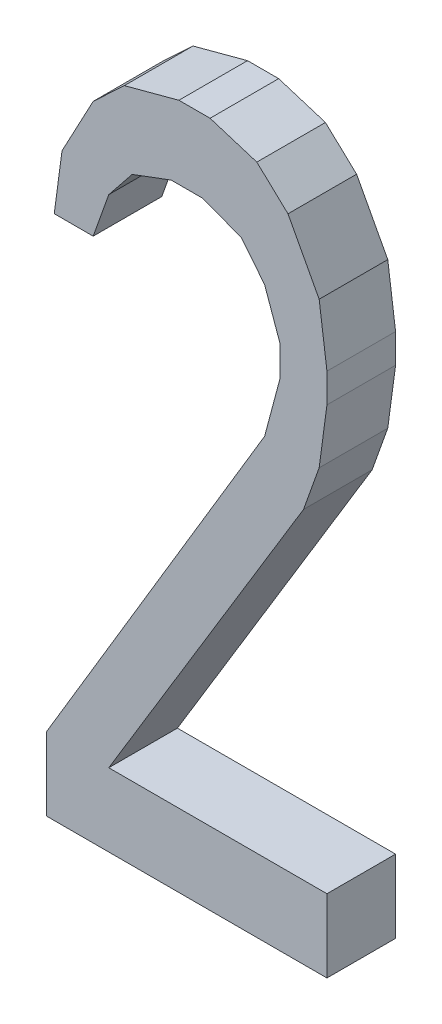
ISO-10303-21;
HEADER;
FILE_DESCRIPTION(('STEP AP214'),'2;1');
FILE_NAME('part.step','',(''),(''),'','','');
FILE_SCHEMA(('AUTOMOTIVE_DESIGN { 1 0 10303 214 1 1 1 1 }'));
ENDSEC;
DATA;
#1=APPLICATION_CONTEXT('core data for automotive mechanical design processes');
#2=APPLICATION_PROTOCOL_DEFINITION('international standard','automotive_design',2000,#1);
#3=PRODUCT_CONTEXT('',#1,'mechanical');
#4=PRODUCT('Part','Part','',(#3));
#5=PRODUCT_RELATED_PRODUCT_CATEGORY('part','',(#4));
#6=PRODUCT_DEFINITION_FORMATION('','',#4);
#7=PRODUCT_DEFINITION_CONTEXT('part definition',#1,'design');
#8=PRODUCT_DEFINITION('design','',#6,#7);
#9=PRODUCT_DEFINITION_SHAPE('','',#8);
#10=(LENGTH_UNIT() NAMED_UNIT(*) SI_UNIT(.MILLI.,.METRE.));
#11=(NAMED_UNIT(*) PLANE_ANGLE_UNIT() SI_UNIT($,.RADIAN.));
#12=(NAMED_UNIT(*) SI_UNIT($,.STERADIAN.) SOLID_ANGLE_UNIT());
#13=UNCERTAINTY_MEASURE_WITH_UNIT(LENGTH_MEASURE(1.E-05),#10,'distance_accuracy_value','');
#14=(GEOMETRIC_REPRESENTATION_CONTEXT(3) GLOBAL_UNCERTAINTY_ASSIGNED_CONTEXT((#13)) GLOBAL_UNIT_ASSIGNED_CONTEXT((#10,
#11,#12)) REPRESENTATION_CONTEXT('',''));
#15=CARTESIAN_POINT('',(0.,0.,0.));
#16=DIRECTION('',(0.,0.,1.));
#17=DIRECTION('',(1.,0.,0.));
#18=AXIS2_PLACEMENT_3D('',#15,#16,#17);
#19=CARTESIAN_POINT('',(-1.04461879526,-0.712240098159247,-20.));
#20=DIRECTION('',(0.,0.,1.));
#21=DIRECTION('',(1.,0.,0.));
#22=AXIS2_PLACEMENT_3D('',#19,#20,#21);
#23=PLANE('',#22);
#24=DIRECTION('',(0.,-1.,0.));
#25=VECTOR('',#24,1.);
#26=CARTESIAN_POINT('',(-25.,-5.987234038115,-20.));
#27=LINE('',#26,#25);
#28=CARTESIAN_POINT('',(-25.,-5.987234038115,-20.));
#29=VERTEX_POINT('',#28);
#30=CARTESIAN_POINT('',(-25.,-6.2,-20.));
#31=VERTEX_POINT('',#30);
#32=EDGE_CURVE('E11',#29,#31,#27,.T.);
#33=ORIENTED_EDGE('',*,*,#32,.F.);
#34=DIRECTION('',(-0.513102593228087,-0.858327285376978,0.));
#35=VECTOR('',#34,1.);
#36=CARTESIAN_POINT('',(-24.36404934028,-4.923404288292,-20.));
#37=LINE('',#36,#35);
#38=CARTESIAN_POINT('',(-24.36404934028,-4.923404288292,-20.));
#39=VERTEX_POINT('',#38);
#40=EDGE_CURVE('E24',#39,#29,#37,.T.);
#41=ORIENTED_EDGE('',*,*,#40,.F.);
#42=DIRECTION('',(-0.257848153420996,-0.966185453097583,0.));
#43=VECTOR('',#42,1.);
#44=CARTESIAN_POINT('',(-24.31862426995,-4.753191542625,-20.));
#45=LINE('',#44,#43);
#46=CARTESIAN_POINT('',(-24.31862426995,-4.753191542625,-20.));
#47=VERTEX_POINT('',#46);
#48=EDGE_CURVE('E220',#47,#39,#45,.T.);
#49=ORIENTED_EDGE('',*,*,#48,.F.);
#50=DIRECTION('',(0.,-1.,0.));
#51=VECTOR('',#50,1.);
#52=CARTESIAN_POINT('',(-24.31862426995,-4.668085050583,-20.));
#53=LINE('',#52,#51);
#54=CARTESIAN_POINT('',(-24.31862426995,-4.668085050583,-20.));
#55=VERTEX_POINT('',#54);
#56=EDGE_CURVE('E355',#55,#47,#53,.T.);
#57=ORIENTED_EDGE('',*,*,#56,.F.);
#58=DIRECTION('',(0.335239001268598,-0.942133117997894,0.));
#59=VECTOR('',#58,1.);
#60=CARTESIAN_POINT('',(-24.36404934028,-4.540425491333,-20.));
#61=LINE('',#60,#59);
#62=CARTESIAN_POINT('',(-24.36404934028,-4.540425491333,-20.));
#63=VERTEX_POINT('',#62);
#64=EDGE_CURVE('E352',#63,#55,#61,.T.);
#65=ORIENTED_EDGE('',*,*,#64,.F.);
#66=DIRECTION('',(0.62498849240601,-0.780633963109512,0.));
#67=VECTOR('',#66,1.);
#68=CARTESIAN_POINT('',(-24.43218691329,-4.4553191185,-20.));
#69=LINE('',#68,#67);
#70=CARTESIAN_POINT('',(-24.43218691329,-4.4553191185,-20.));
#71=VERTEX_POINT('',#70);
#72=EDGE_CURVE('E349',#71,#63,#69,.T.);
#73=ORIENTED_EDGE('',*,*,#72,.F.);
#74=DIRECTION('',(0.93641804705458,-0.350886365010792,0.));
#75=VECTOR('',#74,1.);
#76=CARTESIAN_POINT('',(-24.54574952413,-4.412765932083,-20.));
#77=LINE('',#76,#75);
#78=CARTESIAN_POINT('',(-24.54574952413,-4.412765932083,-20.));
#79=VERTEX_POINT('',#78);
#80=EDGE_CURVE('E346',#79,#71,#77,.T.);
#81=ORIENTED_EDGE('',*,*,#80,.F.);
#82=DIRECTION('',(1.,0.,0.));
#83=VECTOR('',#82,1.);
#84=CARTESIAN_POINT('',(-24.63659959981,-4.412765932083,-20.));
#85=LINE('',#84,#83);
#86=CARTESIAN_POINT('',(-24.63659959981,-4.412765932083,-20.));
#87=VERTEX_POINT('',#86);
#88=EDGE_CURVE('E343',#87,#79,#85,.T.);
#89=ORIENTED_EDGE('',*,*,#88,.F.);
#90=DIRECTION('',(0.936418063547381,0.350886320996093,0.));
#91=VECTOR('',#90,1.);
#92=CARTESIAN_POINT('',(-24.7501622269,-4.4553191185,-20.));
#93=LINE('',#92,#91);
#94=CARTESIAN_POINT('',(-24.7501622269,-4.4553191185,-20.));
#95=VERTEX_POINT('',#94);
#96=EDGE_CURVE('E340',#95,#87,#93,.T.);
#97=ORIENTED_EDGE('',*,*,#96,.F.);
#98=DIRECTION('',(0.62498849240601,0.780633963109512,0.));
#99=VECTOR('',#98,1.);
#100=CARTESIAN_POINT('',(-24.81829979991,-4.540425491333,-20.));
#101=LINE('',#100,#99);
#102=CARTESIAN_POINT('',(-24.81829979991,-4.540425491333,-20.));
#103=VERTEX_POINT('',#102);
#104=EDGE_CURVE('E337',#103,#95,#101,.T.);
#105=ORIENTED_EDGE('',*,*,#104,.F.);
#106=DIRECTION('',(0.335238894851816,0.942133155864145,0.));
#107=VECTOR('',#106,1.);
#108=CARTESIAN_POINT('',(-24.86372485399,-4.668085050583,-20.));
#109=LINE('',#108,#107);
#110=CARTESIAN_POINT('',(-24.86372485399,-4.668085050583,-20.));
#111=VERTEX_POINT('',#110);
#112=EDGE_CURVE('E334',#111,#103,#109,.T.);
#113=ORIENTED_EDGE('',*,*,#112,.F.);
#114=DIRECTION('',(1.,0.,0.));
#115=VECTOR('',#114,1.);
#116=CARTESIAN_POINT('',(-24.97728747499,-4.668085050583,-20.));
#117=LINE('',#116,#115);
#118=CARTESIAN_POINT('',(-24.97728747499,-4.668085050583,-20.));
#119=VERTEX_POINT('',#118);
#120=EDGE_CURVE('E331',#119,#111,#117,.T.);
#121=ORIENTED_EDGE('',*,*,#120,.F.);
#122=DIRECTION('',(-0.132263804293606,-0.991214550979647,0.));
#123=VECTOR('',#122,1.);
#124=CARTESIAN_POINT('',(-24.95457494998,-4.497872304916,-20.));
#125=LINE('',#124,#123);
#126=CARTESIAN_POINT('',(-24.95457494998,-4.497872304916,-20.));
#127=VERTEX_POINT('',#126);
#128=EDGE_CURVE('E328',#127,#119,#125,.T.);
#129=ORIENTED_EDGE('',*,*,#128,.F.);
#130=DIRECTION('',(-0.470870531051395,-0.88220232542619,0.));
#131=VECTOR('',#130,1.);
#132=CARTESIAN_POINT('',(-24.86372485399,-4.32765955925,-20.));
#133=LINE('',#132,#131);
#134=CARTESIAN_POINT('',(-24.86372485399,-4.32765955925,-20.));
#135=VERTEX_POINT('',#134);
#136=EDGE_CURVE('E325',#135,#127,#133,.T.);
#137=ORIENTED_EDGE('',*,*,#136,.F.);
#138=DIRECTION('',(-0.729800038606304,-0.683660664109204,0.));
#139=VECTOR('',#138,1.);
#140=CARTESIAN_POINT('',(-24.77287476207,-4.242553186417,-20.));
#141=LINE('',#140,#139);
#142=CARTESIAN_POINT('',(-24.77287476207,-4.242553186417,-20.));
#143=VERTEX_POINT('',#142);
#144=EDGE_CURVE('E322',#143,#135,#141,.T.);
#145=ORIENTED_EDGE('',*,*,#144,.F.);
#146=DIRECTION('',(-0.965997834211375,-0.258550158187793,0.));
#147=VECTOR('',#146,1.);
#148=CARTESIAN_POINT('',(-24.61388709714,-4.2,-20.));
#149=LINE('',#148,#147);
#150=CARTESIAN_POINT('',(-24.61388709714,-4.2,-20.));
#151=VERTEX_POINT('',#150);
#152=EDGE_CURVE('E319',#151,#143,#149,.T.);
#153=ORIENTED_EDGE('',*,*,#152,.F.);
#154=DIRECTION('',(-1.,0.,0.));
#155=VECTOR('',#154,1.);
#156=CARTESIAN_POINT('',(-24.52303698897,-4.2,-20.));
#157=LINE('',#156,#155);
#158=CARTESIAN_POINT('',(-24.52303698897,-4.2,-20.));
#159=VERTEX_POINT('',#158);
#160=EDGE_CURVE('E316',#159,#151,#157,.T.);
#161=ORIENTED_EDGE('',*,*,#160,.F.);
#162=DIRECTION('',(-0.954545357518661,0.298065698193488,0.));
#163=VECTOR('',#162,1.);
#164=CARTESIAN_POINT('',(-24.38676184296,-4.242553186417,-20.));
#165=LINE('',#164,#163);
#166=CARTESIAN_POINT('',(-24.38676184296,-4.242553186417,-20.));
#167=VERTEX_POINT('',#166);
#168=EDGE_CURVE('E313',#167,#159,#165,.T.);
#169=ORIENTED_EDGE('',*,*,#168,.F.);
#170=DIRECTION('',(-0.729799977612401,0.683660729219501,0.));
#171=VECTOR('',#170,1.);
#172=CARTESIAN_POINT('',(-24.29591176728,-4.32765955925,-20.));
#173=LINE('',#172,#171);
#174=CARTESIAN_POINT('',(-24.29591176728,-4.32765955925,-20.));
#175=VERTEX_POINT('',#174);
#176=EDGE_CURVE('E310',#175,#167,#173,.T.);
#177=ORIENTED_EDGE('',*,*,#176,.F.);
#178=DIRECTION('',(-0.470870711258515,0.882202229241629,0.));
#179=VECTOR('',#178,1.);
#180=CARTESIAN_POINT('',(-24.20506162662,-4.497872304916,-20.));
#181=LINE('',#180,#179);
#182=CARTESIAN_POINT('',(-24.20506162662,-4.497872304916,-20.));
#183=VERTEX_POINT('',#182);
#184=EDGE_CURVE('E307',#183,#175,#181,.T.);
#185=ORIENTED_EDGE('',*,*,#184,.F.);
#186=DIRECTION('',(-0.132263676490904,0.991214568033133,0.));
#187=VECTOR('',#186,1.);
#188=CARTESIAN_POINT('',(-24.18234912395,-4.668085050583,-20.));
#189=LINE('',#188,#187);
#190=CARTESIAN_POINT('',(-24.18234912395,-4.668085050583,-20.));
#191=VERTEX_POINT('',#190);
#192=EDGE_CURVE('E304',#191,#183,#189,.T.);
#193=ORIENTED_EDGE('',*,*,#192,.F.);
#194=DIRECTION('',(0.,1.,0.));
#195=VECTOR('',#194,1.);
#196=CARTESIAN_POINT('',(-24.18234912395,-4.753191542625,-20.));
#197=LINE('',#196,#195);
#198=CARTESIAN_POINT('',(-24.18234912395,-4.753191542625,-20.));
#199=VERTEX_POINT('',#198);
#200=EDGE_CURVE('E301',#199,#191,#197,.T.);
#201=ORIENTED_EDGE('',*,*,#200,.F.);
#202=DIRECTION('',(0.132263676490904,0.991214568033133,0.));
#203=VECTOR('',#202,1.);
#204=CARTESIAN_POINT('',(-24.20506162662,-4.923404288292,-20.));
#205=LINE('',#204,#203);
#206=CARTESIAN_POINT('',(-24.20506162662,-4.923404288292,-20.));
#207=VERTEX_POINT('',#206);
#208=EDGE_CURVE('E298',#207,#199,#205,.T.);
#209=ORIENTED_EDGE('',*,*,#208,.F.);
#210=DIRECTION('',(0.335239001268598,0.942133117997894,0.));
#211=VECTOR('',#210,1.);
#212=CARTESIAN_POINT('',(-24.25048669695,-5.051063847542,-20.));
#213=LINE('',#212,#211);
#214=CARTESIAN_POINT('',(-24.25048669695,-5.051063847542,-20.));
#215=VERTEX_POINT('',#214);
#216=EDGE_CURVE('E295',#215,#207,#213,.T.);
#217=ORIENTED_EDGE('',*,*,#216,.F.);
#218=DIRECTION('',(0.518593741025808,0.855020778559713,0.));
#219=VECTOR('',#218,1.);
#220=CARTESIAN_POINT('',(-24.81829979991,-5.987234038115,-20.));
#221=LINE('',#220,#219);
#222=CARTESIAN_POINT('',(-24.81829979991,-5.987234038115,-20.));
#223=VERTEX_POINT('',#222);
#224=EDGE_CURVE('E292',#223,#215,#221,.T.);
#225=ORIENTED_EDGE('',*,*,#224,.F.);
#226=DIRECTION('',(-1.,0.,0.));
#227=VECTOR('',#226,1.);
#228=CARTESIAN_POINT('',(-24.18234912395,-5.987234038115,-20.));
#229=LINE('',#228,#227);
#230=CARTESIAN_POINT('',(-24.18234912395,-5.987234038115,-20.));
#231=VERTEX_POINT('',#230);
#232=EDGE_CURVE('E289',#231,#223,#229,.T.);
#233=ORIENTED_EDGE('',*,*,#232,.F.);
#234=DIRECTION('',(0.,1.,0.));
#235=VECTOR('',#234,1.);
#236=CARTESIAN_POINT('',(-24.18234912395,-6.2,-20.));
#237=LINE('',#236,#235);
#238=CARTESIAN_POINT('',(-24.18234912395,-6.2,-20.));
#239=VERTEX_POINT('',#238);
#240=EDGE_CURVE('E286',#239,#231,#237,.T.);
#241=ORIENTED_EDGE('',*,*,#240,.F.);
#242=DIRECTION('',(1.,0.,0.));
#243=VECTOR('',#242,1.);
#244=CARTESIAN_POINT('',(-25.,-6.2,-20.));
#245=LINE('',#244,#243);
#246=EDGE_CURVE('E283',#31,#239,#245,.T.);
#247=ORIENTED_EDGE('',*,*,#246,.F.);
#248=EDGE_LOOP('',(#33,#41,#49,#57,#65,#73,#81,#89,#97,#105,#113,#121,#129,#137,#145,#153,#161,
#169,#177,#185,#193,#201,#209,#217,#225,#233,#241,#247));
#249=FACE_BOUND('',#248,.T.);
#250=ADVANCED_FACE('F17',(#249),#23,.F.);
#251=CARTESIAN_POINT('',(0.,0.,-19.8));
#252=DIRECTION('',(0.,0.,1.));
#253=DIRECTION('',(1.,0.,0.));
#254=AXIS2_PLACEMENT_3D('',#251,#252,#253);
#255=PLANE('',#254);
#256=DIRECTION('',(0.,-1.,0.));
#257=VECTOR('',#256,1.);
#258=CARTESIAN_POINT('',(-25.,-5.987234038115,-19.8));
#259=LINE('',#258,#257);
#260=CARTESIAN_POINT('',(-25.,-5.987234038115,-19.8));
#261=VERTEX_POINT('',#260);
#262=CARTESIAN_POINT('',(-25.,-6.2,-19.8));
#263=VERTEX_POINT('',#262);
#264=EDGE_CURVE('E281',#261,#263,#259,.T.);
#265=ORIENTED_EDGE('',*,*,#264,.T.);
#266=DIRECTION('',(1.,0.,0.));
#267=VECTOR('',#266,1.);
#268=CARTESIAN_POINT('',(-25.,-6.2,-19.8));
#269=LINE('',#268,#267);
#270=CARTESIAN_POINT('',(-24.18234912395,-6.2,-19.8));
#271=VERTEX_POINT('',#270);
#272=EDGE_CURVE('E279',#263,#271,#269,.T.);
#273=ORIENTED_EDGE('',*,*,#272,.T.);
#274=DIRECTION('',(0.,1.,0.));
#275=VECTOR('',#274,1.);
#276=CARTESIAN_POINT('',(-24.18234912395,-6.2,-19.8));
#277=LINE('',#276,#275);
#278=CARTESIAN_POINT('',(-24.18234912395,-5.987234038115,-19.8));
#279=VERTEX_POINT('',#278);
#280=EDGE_CURVE('E277',#271,#279,#277,.T.);
#281=ORIENTED_EDGE('',*,*,#280,.T.);
#282=DIRECTION('',(-1.,0.,0.));
#283=VECTOR('',#282,1.);
#284=CARTESIAN_POINT('',(-24.18234912395,-5.987234038115,-19.8));
#285=LINE('',#284,#283);
#286=CARTESIAN_POINT('',(-24.81829979991,-5.987234038115,-19.8));
#287=VERTEX_POINT('',#286);
#288=EDGE_CURVE('E275',#279,#287,#285,.T.);
#289=ORIENTED_EDGE('',*,*,#288,.T.);
#290=DIRECTION('',(0.518593741025808,0.855020778559713,0.));
#291=VECTOR('',#290,1.);
#292=CARTESIAN_POINT('',(-24.81829979991,-5.987234038115,-19.8));
#293=LINE('',#292,#291);
#294=CARTESIAN_POINT('',(-24.25048669695,-5.051063847542,-19.8));
#295=VERTEX_POINT('',#294);
#296=EDGE_CURVE('E273',#287,#295,#293,.T.);
#297=ORIENTED_EDGE('',*,*,#296,.T.);
#298=DIRECTION('',(0.335239001268598,0.942133117997894,0.));
#299=VECTOR('',#298,1.);
#300=CARTESIAN_POINT('',(-24.25048669695,-5.051063847542,-19.8));
#301=LINE('',#300,#299);
#302=CARTESIAN_POINT('',(-24.20506162662,-4.923404288292,-19.8));
#303=VERTEX_POINT('',#302);
#304=EDGE_CURVE('E271',#295,#303,#301,.T.);
#305=ORIENTED_EDGE('',*,*,#304,.T.);
#306=DIRECTION('',(0.132263676490904,0.991214568033133,0.));
#307=VECTOR('',#306,1.);
#308=CARTESIAN_POINT('',(-24.20506162662,-4.923404288292,-19.8));
#309=LINE('',#308,#307);
#310=CARTESIAN_POINT('',(-24.18234912395,-4.753191542625,-19.8));
#311=VERTEX_POINT('',#310);
#312=EDGE_CURVE('E269',#303,#311,#309,.T.);
#313=ORIENTED_EDGE('',*,*,#312,.T.);
#314=DIRECTION('',(0.,1.,0.));
#315=VECTOR('',#314,1.);
#316=CARTESIAN_POINT('',(-24.18234912395,-4.753191542625,-19.8));
#317=LINE('',#316,#315);
#318=CARTESIAN_POINT('',(-24.18234912395,-4.668085050583,-19.8));
#319=VERTEX_POINT('',#318);
#320=EDGE_CURVE('E267',#311,#319,#317,.T.);
#321=ORIENTED_EDGE('',*,*,#320,.T.);
#322=DIRECTION('',(-0.132263676490904,0.991214568033133,0.));
#323=VECTOR('',#322,1.);
#324=CARTESIAN_POINT('',(-24.18234912395,-4.668085050583,-19.8));
#325=LINE('',#324,#323);
#326=CARTESIAN_POINT('',(-24.20506162662,-4.497872304916,-19.8));
#327=VERTEX_POINT('',#326);
#328=EDGE_CURVE('E265',#319,#327,#325,.T.);
#329=ORIENTED_EDGE('',*,*,#328,.T.);
#330=DIRECTION('',(-0.470870711258515,0.882202229241629,0.));
#331=VECTOR('',#330,1.);
#332=CARTESIAN_POINT('',(-24.20506162662,-4.497872304916,-19.8));
#333=LINE('',#332,#331);
#334=CARTESIAN_POINT('',(-24.29591176728,-4.32765955925,-19.8));
#335=VERTEX_POINT('',#334);
#336=EDGE_CURVE('E263',#327,#335,#333,.T.);
#337=ORIENTED_EDGE('',*,*,#336,.T.);
#338=DIRECTION('',(-0.729799977612401,0.683660729219501,0.));
#339=VECTOR('',#338,1.);
#340=CARTESIAN_POINT('',(-24.29591176728,-4.32765955925,-19.8));
#341=LINE('',#340,#339);
#342=CARTESIAN_POINT('',(-24.38676184296,-4.242553186417,-19.8));
#343=VERTEX_POINT('',#342);
#344=EDGE_CURVE('E261',#335,#343,#341,.T.);
#345=ORIENTED_EDGE('',*,*,#344,.T.);
#346=DIRECTION('',(-0.954545357518661,0.298065698193488,0.));
#347=VECTOR('',#346,1.);
#348=CARTESIAN_POINT('',(-24.38676184296,-4.242553186417,-19.8));
#349=LINE('',#348,#347);
#350=CARTESIAN_POINT('',(-24.52303698897,-4.2,-19.8));
#351=VERTEX_POINT('',#350);
#352=EDGE_CURVE('E258',#343,#351,#349,.T.);
#353=ORIENTED_EDGE('',*,*,#352,.T.);
#354=DIRECTION('',(-1.,0.,0.));
#355=VECTOR('',#354,1.);
#356=CARTESIAN_POINT('',(-24.52303698897,-4.2,-19.8));
#357=LINE('',#356,#355);
#358=CARTESIAN_POINT('',(-24.61388709714,-4.2,-19.8));
#359=VERTEX_POINT('',#358);
#360=EDGE_CURVE('E255',#351,#359,#357,.T.);
#361=ORIENTED_EDGE('',*,*,#360,.T.);
#362=DIRECTION('',(-0.965997834211375,-0.258550158187793,0.));
#363=VECTOR('',#362,1.);
#364=CARTESIAN_POINT('',(-24.61388709714,-4.2,-19.8));
#365=LINE('',#364,#363);
#366=CARTESIAN_POINT('',(-24.77287476207,-4.242553186417,-19.8));
#367=VERTEX_POINT('',#366);
#368=EDGE_CURVE('E252',#359,#367,#365,.T.);
#369=ORIENTED_EDGE('',*,*,#368,.T.);
#370=DIRECTION('',(-0.729800038606304,-0.683660664109204,0.));
#371=VECTOR('',#370,1.);
#372=CARTESIAN_POINT('',(-24.77287476207,-4.242553186417,-19.8));
#373=LINE('',#372,#371);
#374=CARTESIAN_POINT('',(-24.86372485399,-4.32765955925,-19.8));
#375=VERTEX_POINT('',#374);
#376=EDGE_CURVE('E250',#367,#375,#373,.T.);
#377=ORIENTED_EDGE('',*,*,#376,.T.);
#378=DIRECTION('',(-0.470870531051395,-0.88220232542619,0.));
#379=VECTOR('',#378,1.);
#380=CARTESIAN_POINT('',(-24.86372485399,-4.32765955925,-19.8));
#381=LINE('',#380,#379);
#382=CARTESIAN_POINT('',(-24.95457494998,-4.497872304916,-19.8));
#383=VERTEX_POINT('',#382);
#384=EDGE_CURVE('E248',#375,#383,#381,.T.);
#385=ORIENTED_EDGE('',*,*,#384,.T.);
#386=DIRECTION('',(-0.132263804293606,-0.991214550979647,0.));
#387=VECTOR('',#386,1.);
#388=CARTESIAN_POINT('',(-24.95457494998,-4.497872304916,-19.8));
#389=LINE('',#388,#387);
#390=CARTESIAN_POINT('',(-24.97728747499,-4.668085050583,-19.8));
#391=VERTEX_POINT('',#390);
#392=EDGE_CURVE('E246',#383,#391,#389,.T.);
#393=ORIENTED_EDGE('',*,*,#392,.T.);
#394=DIRECTION('',(1.,0.,0.));
#395=VECTOR('',#394,1.);
#396=CARTESIAN_POINT('',(-24.97728747499,-4.668085050583,-19.8));
#397=LINE('',#396,#395);
#398=CARTESIAN_POINT('',(-24.86372485399,-4.668085050583,-19.8));
#399=VERTEX_POINT('',#398);
#400=EDGE_CURVE('E244',#391,#399,#397,.T.);
#401=ORIENTED_EDGE('',*,*,#400,.T.);
#402=DIRECTION('',(0.335238894851816,0.942133155864145,0.));
#403=VECTOR('',#402,1.);
#404=CARTESIAN_POINT('',(-24.86372485399,-4.668085050583,-19.8));
#405=LINE('',#404,#403);
#406=CARTESIAN_POINT('',(-24.81829979991,-4.540425491333,-19.8));
#407=VERTEX_POINT('',#406);
#408=EDGE_CURVE('E242',#399,#407,#405,.T.);
#409=ORIENTED_EDGE('',*,*,#408,.T.);
#410=DIRECTION('',(0.62498849240601,0.780633963109512,0.));
#411=VECTOR('',#410,1.);
#412=CARTESIAN_POINT('',(-24.81829979991,-4.540425491333,-19.8));
#413=LINE('',#412,#411);
#414=CARTESIAN_POINT('',(-24.7501622269,-4.4553191185,-19.8));
#415=VERTEX_POINT('',#414);
#416=EDGE_CURVE('E240',#407,#415,#413,.T.);
#417=ORIENTED_EDGE('',*,*,#416,.T.);
#418=DIRECTION('',(0.936418063547381,0.350886320996093,0.));
#419=VECTOR('',#418,1.);
#420=CARTESIAN_POINT('',(-24.7501622269,-4.4553191185,-19.8));
#421=LINE('',#420,#419);
#422=CARTESIAN_POINT('',(-24.63659959981,-4.412765932083,-19.8));
#423=VERTEX_POINT('',#422);
#424=EDGE_CURVE('E238',#415,#423,#421,.T.);
#425=ORIENTED_EDGE('',*,*,#424,.T.);
#426=DIRECTION('',(1.,0.,0.));
#427=VECTOR('',#426,1.);
#428=CARTESIAN_POINT('',(-24.63659959981,-4.412765932083,-19.8));
#429=LINE('',#428,#427);
#430=CARTESIAN_POINT('',(-24.54574952413,-4.412765932083,-19.8));
#431=VERTEX_POINT('',#430);
#432=EDGE_CURVE('E236',#423,#431,#429,.T.);
#433=ORIENTED_EDGE('',*,*,#432,.T.);
#434=DIRECTION('',(0.93641804705458,-0.350886365010792,0.));
#435=VECTOR('',#434,1.);
#436=CARTESIAN_POINT('',(-24.54574952413,-4.412765932083,-19.8));
#437=LINE('',#436,#435);
#438=CARTESIAN_POINT('',(-24.43218691329,-4.4553191185,-19.8));
#439=VERTEX_POINT('',#438);
#440=EDGE_CURVE('E234',#431,#439,#437,.T.);
#441=ORIENTED_EDGE('',*,*,#440,.T.);
#442=DIRECTION('',(0.62498849240601,-0.780633963109512,0.));
#443=VECTOR('',#442,1.);
#444=CARTESIAN_POINT('',(-24.43218691329,-4.4553191185,-19.8));
#445=LINE('',#444,#443);
#446=CARTESIAN_POINT('',(-24.36404934028,-4.540425491333,-19.8));
#447=VERTEX_POINT('',#446);
#448=EDGE_CURVE('E232',#439,#447,#445,.T.);
#449=ORIENTED_EDGE('',*,*,#448,.T.);
#450=DIRECTION('',(0.335239001268598,-0.942133117997894,0.));
#451=VECTOR('',#450,1.);
#452=CARTESIAN_POINT('',(-24.36404934028,-4.540425491333,-19.8));
#453=LINE('',#452,#451);
#454=CARTESIAN_POINT('',(-24.31862426995,-4.668085050583,-19.8));
#455=VERTEX_POINT('',#454);
#456=EDGE_CURVE('E230',#447,#455,#453,.T.);
#457=ORIENTED_EDGE('',*,*,#456,.T.);
#458=DIRECTION('',(0.,-1.,0.));
#459=VECTOR('',#458,1.);
#460=CARTESIAN_POINT('',(-24.31862426995,-4.668085050583,-19.8));
#461=LINE('',#460,#459);
#462=CARTESIAN_POINT('',(-24.31862426995,-4.753191542625,-19.8));
#463=VERTEX_POINT('',#462);
#464=EDGE_CURVE('E204',#455,#463,#461,.T.);
#465=ORIENTED_EDGE('',*,*,#464,.T.);
#466=DIRECTION('',(-0.257848153420996,-0.966185453097583,0.));
#467=VECTOR('',#466,1.);
#468=CARTESIAN_POINT('',(-24.31862426995,-4.753191542625,-19.8));
#469=LINE('',#468,#467);
#470=CARTESIAN_POINT('',(-24.36404934028,-4.923404288292,-19.8));
#471=VERTEX_POINT('',#470);
#472=EDGE_CURVE('E197',#463,#471,#469,.T.);
#473=ORIENTED_EDGE('',*,*,#472,.T.);
#474=DIRECTION('',(-0.513102593228087,-0.858327285376978,0.));
#475=VECTOR('',#474,1.);
#476=CARTESIAN_POINT('',(-24.36404934028,-4.923404288292,-19.8));
#477=LINE('',#476,#475);
#478=EDGE_CURVE('E201',#471,#261,#477,.T.);
#479=ORIENTED_EDGE('',*,*,#478,.T.);
#480=EDGE_LOOP('',(#265,#273,#281,#289,#297,#305,#313,#321,#329,#337,#345,#353,#361,#369,#377,
#385,#393,#401,#409,#417,#425,#433,#441,#449,#457,#465,#473,#479));
#481=FACE_BOUND('',#480,.T.);
#482=ADVANCED_FACE('F200',(#481),#255,.T.);
#483=CARTESIAN_POINT('',(-25.,-5.987234038115,-20.));
#484=DIRECTION('',(-1.,0.,0.));
#485=DIRECTION('',(0.,-1.,0.));
#486=AXIS2_PLACEMENT_3D('',#483,#484,#485);
#487=PLANE('',#486);
#488=ORIENTED_EDGE('',*,*,#32,.T.);
#489=DIRECTION('',(0.,0.,1.));
#490=VECTOR('',#489,1.);
#491=CARTESIAN_POINT('',(-25.,-6.2,-20.));
#492=LINE('',#491,#490);
#493=EDGE_CURVE('E216',#31,#263,#492,.T.);
#494=ORIENTED_EDGE('',*,*,#493,.T.);
#495=ORIENTED_EDGE('',*,*,#264,.F.);
#496=DIRECTION('',(0.,0.,1.));
#497=VECTOR('',#496,1.);
#498=CARTESIAN_POINT('',(-25.,-5.987234038115,-20.));
#499=LINE('',#498,#497);
#500=EDGE_CURVE('E214',#29,#261,#499,.T.);
#501=ORIENTED_EDGE('',*,*,#500,.F.);
#502=EDGE_LOOP('',(#488,#494,#495,#501));
#503=FACE_BOUND('',#502,.T.);
#504=ADVANCED_FACE('F358',(#503),#487,.T.);
#505=CARTESIAN_POINT('',(-24.36404934028,-4.923404288292,-20.));
#506=DIRECTION('',(-0.858327285376978,0.513102593228087,0.));
#507=DIRECTION('',(-0.513102593228087,-0.858327285376978,0.));
#508=AXIS2_PLACEMENT_3D('',#505,#506,#507);
#509=PLANE('',#508);
#510=ORIENTED_EDGE('',*,*,#40,.T.);
#511=ORIENTED_EDGE('',*,*,#500,.T.);
#512=ORIENTED_EDGE('',*,*,#478,.F.);
#513=DIRECTION('',(0.,0.,1.));
#514=VECTOR('',#513,1.);
#515=CARTESIAN_POINT('',(-24.36404934028,-4.923404288292,-20.));
#516=LINE('',#515,#514);
#517=EDGE_CURVE('E213',#39,#471,#516,.T.);
#518=ORIENTED_EDGE('',*,*,#517,.F.);
#519=EDGE_LOOP('',(#510,#511,#512,#518));
#520=FACE_BOUND('',#519,.T.);
#521=ADVANCED_FACE('F212',(#520),#509,.T.);
#522=CARTESIAN_POINT('',(-24.31862426995,-4.753191542625,-20.));
#523=DIRECTION('',(-0.966185453097584,0.257848153420996,0.));
#524=DIRECTION('',(-0.257848153420996,-0.966185453097584,0.));
#525=AXIS2_PLACEMENT_3D('',#522,#523,#524);
#526=PLANE('',#525);
#527=ORIENTED_EDGE('',*,*,#48,.T.);
#528=ORIENTED_EDGE('',*,*,#517,.T.);
#529=ORIENTED_EDGE('',*,*,#472,.F.);
#530=DIRECTION('',(0.,0.,1.));
#531=VECTOR('',#530,1.);
#532=CARTESIAN_POINT('',(-24.31862426995,-4.753191542625,-20.));
#533=LINE('',#532,#531);
#534=EDGE_CURVE('E221',#47,#463,#533,.T.);
#535=ORIENTED_EDGE('',*,*,#534,.F.);
#536=EDGE_LOOP('',(#527,#528,#529,#535));
#537=FACE_BOUND('',#536,.T.);
#538=ADVANCED_FACE('F219',(#537),#526,.T.);
#539=CARTESIAN_POINT('',(-24.31862426995,-4.668085050583,-20.));
#540=DIRECTION('',(-1.,0.,0.));
#541=DIRECTION('',(0.,-1.,0.));
#542=AXIS2_PLACEMENT_3D('',#539,#540,#541);
#543=PLANE('',#542);
#544=ORIENTED_EDGE('',*,*,#56,.T.);
#545=ORIENTED_EDGE('',*,*,#534,.T.);
#546=ORIENTED_EDGE('',*,*,#464,.F.);
#547=DIRECTION('',(0.,0.,1.));
#548=VECTOR('',#547,1.);
#549=CARTESIAN_POINT('',(-24.31862426995,-4.668085050583,-20.));
#550=LINE('',#549,#548);
#551=EDGE_CURVE('E224',#55,#455,#550,.T.);
#552=ORIENTED_EDGE('',*,*,#551,.F.);
#553=EDGE_LOOP('',(#544,#545,#546,#552));
#554=FACE_BOUND('',#553,.T.);
#555=ADVANCED_FACE('F439',(#554),#543,.T.);
#556=CARTESIAN_POINT('',(-24.36404934028,-4.540425491333,-20.));
#557=DIRECTION('',(-0.942133117997894,-0.335239001268598,0.));
#558=DIRECTION('',(0.335239001268598,-0.942133117997894,0.));
#559=AXIS2_PLACEMENT_3D('',#556,#557,#558);
#560=PLANE('',#559);
#561=ORIENTED_EDGE('',*,*,#64,.T.);
#562=ORIENTED_EDGE('',*,*,#551,.T.);
#563=ORIENTED_EDGE('',*,*,#456,.F.);
#564=DIRECTION('',(0.,0.,1.));
#565=VECTOR('',#564,1.);
#566=CARTESIAN_POINT('',(-24.36404934028,-4.540425491333,-20.));
#567=LINE('',#566,#565);
#568=EDGE_CURVE('E430',#63,#447,#567,.T.);
#569=ORIENTED_EDGE('',*,*,#568,.F.);
#570=EDGE_LOOP('',(#561,#562,#563,#569));
#571=FACE_BOUND('',#570,.T.);
#572=ADVANCED_FACE('F436',(#571),#560,.T.);
#573=CARTESIAN_POINT('',(-24.43218691329,-4.4553191185,-20.));
#574=DIRECTION('',(-0.780633963109512,-0.62498849240601,0.));
#575=DIRECTION('',(0.62498849240601,-0.780633963109512,0.));
#576=AXIS2_PLACEMENT_3D('',#573,#574,#575);
#577=PLANE('',#576);
#578=ORIENTED_EDGE('',*,*,#72,.T.);
#579=ORIENTED_EDGE('',*,*,#568,.T.);
#580=ORIENTED_EDGE('',*,*,#448,.F.);
#581=DIRECTION('',(0.,0.,1.));
#582=VECTOR('',#581,1.);
#583=CARTESIAN_POINT('',(-24.43218691329,-4.4553191185,-20.));
#584=LINE('',#583,#582);
#585=EDGE_CURVE('E427',#71,#439,#584,.T.);
#586=ORIENTED_EDGE('',*,*,#585,.F.);
#587=EDGE_LOOP('',(#578,#579,#580,#586));
#588=FACE_BOUND('',#587,.T.);
#589=ADVANCED_FACE('F442',(#588),#577,.T.);
#590=CARTESIAN_POINT('',(-24.54574952413,-4.412765932083,-20.));
#591=DIRECTION('',(-0.350886365010792,-0.93641804705458,0.));
#592=DIRECTION('',(0.93641804705458,-0.350886365010792,0.));
#593=AXIS2_PLACEMENT_3D('',#590,#591,#592);
#594=PLANE('',#593);
#595=ORIENTED_EDGE('',*,*,#80,.T.);
#596=ORIENTED_EDGE('',*,*,#585,.T.);
#597=ORIENTED_EDGE('',*,*,#440,.F.);
#598=DIRECTION('',(0.,0.,1.));
#599=VECTOR('',#598,1.);
#600=CARTESIAN_POINT('',(-24.54574952413,-4.412765932083,-20.));
#601=LINE('',#600,#599);
#602=EDGE_CURVE('E424',#79,#431,#601,.T.);
#603=ORIENTED_EDGE('',*,*,#602,.F.);
#604=EDGE_LOOP('',(#595,#596,#597,#603));
#605=FACE_BOUND('',#604,.T.);
#606=ADVANCED_FACE('F446',(#605),#594,.T.);
#607=CARTESIAN_POINT('',(-24.63659959981,-4.412765932083,-20.));
#608=DIRECTION('',(0.,-1.,0.));
#609=DIRECTION('',(1.,0.,0.));
#610=AXIS2_PLACEMENT_3D('',#607,#608,#609);
#611=PLANE('',#610);
#612=ORIENTED_EDGE('',*,*,#88,.T.);
#613=ORIENTED_EDGE('',*,*,#602,.T.);
#614=ORIENTED_EDGE('',*,*,#432,.F.);
#615=DIRECTION('',(0.,0.,1.));
#616=VECTOR('',#615,1.);
#617=CARTESIAN_POINT('',(-24.63659959981,-4.412765932083,-20.));
#618=LINE('',#617,#616);
#619=EDGE_CURVE('E421',#87,#423,#618,.T.);
#620=ORIENTED_EDGE('',*,*,#619,.F.);
#621=EDGE_LOOP('',(#612,#613,#614,#620));
#622=FACE_BOUND('',#621,.T.);
#623=ADVANCED_FACE('F450',(#622),#611,.T.);
#624=CARTESIAN_POINT('',(-24.7501622269,-4.4553191185,-20.));
#625=DIRECTION('',(0.350886320996093,-0.936418063547381,0.));
#626=DIRECTION('',(0.936418063547381,0.350886320996093,0.));
#627=AXIS2_PLACEMENT_3D('',#624,#625,#626);
#628=PLANE('',#627);
#629=ORIENTED_EDGE('',*,*,#96,.T.);
#630=ORIENTED_EDGE('',*,*,#619,.T.);
#631=ORIENTED_EDGE('',*,*,#424,.F.);
#632=DIRECTION('',(0.,0.,1.));
#633=VECTOR('',#632,1.);
#634=CARTESIAN_POINT('',(-24.7501622269,-4.4553191185,-20.));
#635=LINE('',#634,#633);
#636=EDGE_CURVE('E418',#95,#415,#635,.T.);
#637=ORIENTED_EDGE('',*,*,#636,.F.);
#638=EDGE_LOOP('',(#629,#630,#631,#637));
#639=FACE_BOUND('',#638,.T.);
#640=ADVANCED_FACE('F454',(#639),#628,.T.);
#641=CARTESIAN_POINT('',(-24.81829979991,-4.540425491333,-20.));
#642=DIRECTION('',(0.780633963109512,-0.62498849240601,0.));
#643=DIRECTION('',(0.62498849240601,0.780633963109512,0.));
#644=AXIS2_PLACEMENT_3D('',#641,#642,#643);
#645=PLANE('',#644);
#646=ORIENTED_EDGE('',*,*,#104,.T.);
#647=ORIENTED_EDGE('',*,*,#636,.T.);
#648=ORIENTED_EDGE('',*,*,#416,.F.);
#649=DIRECTION('',(0.,0.,1.));
#650=VECTOR('',#649,1.);
#651=CARTESIAN_POINT('',(-24.81829979991,-4.540425491333,-20.));
#652=LINE('',#651,#650);
#653=EDGE_CURVE('E415',#103,#407,#652,.T.);
#654=ORIENTED_EDGE('',*,*,#653,.F.);
#655=EDGE_LOOP('',(#646,#647,#648,#654));
#656=FACE_BOUND('',#655,.T.);
#657=ADVANCED_FACE('F458',(#656),#645,.T.);
#658=CARTESIAN_POINT('',(-24.86372485399,-4.668085050583,-20.));
#659=DIRECTION('',(0.942133155864145,-0.335238894851816,0.));
#660=DIRECTION('',(0.335238894851816,0.942133155864145,0.));
#661=AXIS2_PLACEMENT_3D('',#658,#659,#660);
#662=PLANE('',#661);
#663=ORIENTED_EDGE('',*,*,#112,.T.);
#664=ORIENTED_EDGE('',*,*,#653,.T.);
#665=ORIENTED_EDGE('',*,*,#408,.F.);
#666=DIRECTION('',(0.,0.,1.));
#667=VECTOR('',#666,1.);
#668=CARTESIAN_POINT('',(-24.86372485399,-4.668085050583,-20.));
#669=LINE('',#668,#667);
#670=EDGE_CURVE('E412',#111,#399,#669,.T.);
#671=ORIENTED_EDGE('',*,*,#670,.F.);
#672=EDGE_LOOP('',(#663,#664,#665,#671));
#673=FACE_BOUND('',#672,.T.);
#674=ADVANCED_FACE('F462',(#673),#662,.T.);
#675=CARTESIAN_POINT('',(-24.97728747499,-4.668085050583,-20.));
#676=DIRECTION('',(0.,-1.,0.));
#677=DIRECTION('',(1.,0.,0.));
#678=AXIS2_PLACEMENT_3D('',#675,#676,#677);
#679=PLANE('',#678);
#680=ORIENTED_EDGE('',*,*,#120,.T.);
#681=ORIENTED_EDGE('',*,*,#670,.T.);
#682=ORIENTED_EDGE('',*,*,#400,.F.);
#683=DIRECTION('',(0.,0.,1.));
#684=VECTOR('',#683,1.);
#685=CARTESIAN_POINT('',(-24.97728747499,-4.668085050583,-20.));
#686=LINE('',#685,#684);
#687=EDGE_CURVE('E409',#119,#391,#686,.T.);
#688=ORIENTED_EDGE('',*,*,#687,.F.);
#689=EDGE_LOOP('',(#680,#681,#682,#688));
#690=FACE_BOUND('',#689,.T.);
#691=ADVANCED_FACE('F466',(#690),#679,.T.);
#692=CARTESIAN_POINT('',(-24.95457494998,-4.497872304916,-20.));
#693=DIRECTION('',(-0.991214550979634,0.132263804293704,0.));
#694=DIRECTION('',(-0.132263804293704,-0.991214550979634,0.));
#695=AXIS2_PLACEMENT_3D('',#692,#693,#694);
#696=PLANE('',#695);
#697=ORIENTED_EDGE('',*,*,#128,.T.);
#698=ORIENTED_EDGE('',*,*,#687,.T.);
#699=ORIENTED_EDGE('',*,*,#392,.F.);
#700=DIRECTION('',(0.,0.,1.));
#701=VECTOR('',#700,1.);
#702=CARTESIAN_POINT('',(-24.95457494998,-4.497872304916,-20.));
#703=LINE('',#702,#701);
#704=EDGE_CURVE('E406',#127,#383,#703,.T.);
#705=ORIENTED_EDGE('',*,*,#704,.F.);
#706=EDGE_LOOP('',(#697,#698,#699,#705));
#707=FACE_BOUND('',#706,.T.);
#708=ADVANCED_FACE('F470',(#707),#696,.T.);
#709=CARTESIAN_POINT('',(-24.86372485399,-4.32765955925,-20.));
#710=DIRECTION('',(-0.88220232542619,0.470870531051395,0.));
#711=DIRECTION('',(-0.470870531051395,-0.88220232542619,0.));
#712=AXIS2_PLACEMENT_3D('',#709,#710,#711);
#713=PLANE('',#712);
#714=ORIENTED_EDGE('',*,*,#136,.T.);
#715=ORIENTED_EDGE('',*,*,#704,.T.);
#716=ORIENTED_EDGE('',*,*,#384,.F.);
#717=DIRECTION('',(0.,0.,1.));
#718=VECTOR('',#717,1.);
#719=CARTESIAN_POINT('',(-24.86372485399,-4.32765955925,-20.));
#720=LINE('',#719,#718);
#721=EDGE_CURVE('E403',#135,#375,#720,.T.);
#722=ORIENTED_EDGE('',*,*,#721,.F.);
#723=EDGE_LOOP('',(#714,#715,#716,#722));
#724=FACE_BOUND('',#723,.T.);
#725=ADVANCED_FACE('F474',(#724),#713,.T.);
#726=CARTESIAN_POINT('',(-24.77287476207,-4.242553186417,-20.));
#727=DIRECTION('',(-0.683660664109204,0.729800038606304,0.));
#728=DIRECTION('',(-0.729800038606304,-0.683660664109204,0.));
#729=AXIS2_PLACEMENT_3D('',#726,#727,#728);
#730=PLANE('',#729);
#731=ORIENTED_EDGE('',*,*,#144,.T.);
#732=ORIENTED_EDGE('',*,*,#721,.T.);
#733=ORIENTED_EDGE('',*,*,#376,.F.);
#734=DIRECTION('',(0.,0.,1.));
#735=VECTOR('',#734,1.);
#736=CARTESIAN_POINT('',(-24.77287476207,-4.242553186417,-20.));
#737=LINE('',#736,#735);
#738=EDGE_CURVE('E400',#143,#367,#737,.T.);
#739=ORIENTED_EDGE('',*,*,#738,.F.);
#740=EDGE_LOOP('',(#731,#732,#733,#739));
#741=FACE_BOUND('',#740,.T.);
#742=ADVANCED_FACE('F477',(#741),#730,.T.);
#743=CARTESIAN_POINT('',(-24.61388709714,-4.2,-20.));
#744=DIRECTION('',(-0.2585501581877,0.9659978342114,0.));
#745=DIRECTION('',(-0.9659978342114,-0.2585501581877,0.));
#746=AXIS2_PLACEMENT_3D('',#743,#744,#745);
#747=PLANE('',#746);
#748=ORIENTED_EDGE('',*,*,#152,.T.);
#749=ORIENTED_EDGE('',*,*,#738,.T.);
#750=ORIENTED_EDGE('',*,*,#368,.F.);
#751=DIRECTION('',(0.,0.,1.));
#752=VECTOR('',#751,1.);
#753=CARTESIAN_POINT('',(-24.61388709714,-4.2,-20.));
#754=LINE('',#753,#752);
#755=EDGE_CURVE('E398',#151,#359,#754,.T.);
#756=ORIENTED_EDGE('',*,*,#755,.F.);
#757=EDGE_LOOP('',(#748,#749,#750,#756));
#758=FACE_BOUND('',#757,.T.);
#759=ADVANCED_FACE('F481',(#758),#747,.T.);
#760=CARTESIAN_POINT('',(-24.52303698897,-4.2,-20.));
#761=DIRECTION('',(0.,1.,0.));
#762=DIRECTION('',(-1.,0.,0.));
#763=AXIS2_PLACEMENT_3D('',#760,#761,#762);
#764=PLANE('',#763);
#765=ORIENTED_EDGE('',*,*,#160,.T.);
#766=ORIENTED_EDGE('',*,*,#755,.T.);
#767=ORIENTED_EDGE('',*,*,#360,.F.);
#768=DIRECTION('',(0.,0.,1.));
#769=VECTOR('',#768,1.);
#770=CARTESIAN_POINT('',(-24.52303698897,-4.2,-20.));
#771=LINE('',#770,#769);
#772=EDGE_CURVE('E396',#159,#351,#771,.T.);
#773=ORIENTED_EDGE('',*,*,#772,.F.);
#774=EDGE_LOOP('',(#765,#766,#767,#773));
#775=FACE_BOUND('',#774,.T.);
#776=ADVANCED_FACE('F485',(#775),#764,.T.);
#777=CARTESIAN_POINT('',(-24.38676184296,-4.242553186417,-20.));
#778=DIRECTION('',(0.298065698193488,0.954545357518661,0.));
#779=DIRECTION('',(-0.954545357518661,0.298065698193488,0.));
#780=AXIS2_PLACEMENT_3D('',#777,#778,#779);
#781=PLANE('',#780);
#782=ORIENTED_EDGE('',*,*,#168,.T.);
#783=ORIENTED_EDGE('',*,*,#772,.T.);
#784=ORIENTED_EDGE('',*,*,#352,.F.);
#785=DIRECTION('',(0.,0.,1.));
#786=VECTOR('',#785,1.);
#787=CARTESIAN_POINT('',(-24.38676184296,-4.242553186417,-20.));
#788=LINE('',#787,#786);
#789=EDGE_CURVE('E393',#167,#343,#788,.T.);
#790=ORIENTED_EDGE('',*,*,#789,.F.);
#791=EDGE_LOOP('',(#782,#783,#784,#790));
#792=FACE_BOUND('',#791,.T.);
#793=ADVANCED_FACE('F491',(#792),#781,.T.);
#794=CARTESIAN_POINT('',(-24.29591176728,-4.32765955925,-20.));
#795=DIRECTION('',(0.683660729219501,0.729799977612401,0.));
#796=DIRECTION('',(-0.729799977612401,0.683660729219501,0.));
#797=AXIS2_PLACEMENT_3D('',#794,#795,#796);
#798=PLANE('',#797);
#799=ORIENTED_EDGE('',*,*,#176,.T.);
#800=ORIENTED_EDGE('',*,*,#789,.T.);
#801=ORIENTED_EDGE('',*,*,#344,.F.);
#802=DIRECTION('',(0.,0.,1.));
#803=VECTOR('',#802,1.);
#804=CARTESIAN_POINT('',(-24.29591176728,-4.32765955925,-20.));
#805=LINE('',#804,#803);
#806=EDGE_CURVE('E390',#175,#335,#805,.T.);
#807=ORIENTED_EDGE('',*,*,#806,.F.);
#808=EDGE_LOOP('',(#799,#800,#801,#807));
#809=FACE_BOUND('',#808,.T.);
#810=ADVANCED_FACE('F493',(#809),#798,.T.);
#811=CARTESIAN_POINT('',(-24.20506162662,-4.497872304916,-20.));
#812=DIRECTION('',(0.882202229241629,0.470870711258516,0.));
#813=DIRECTION('',(-0.470870711258516,0.882202229241629,0.));
#814=AXIS2_PLACEMENT_3D('',#811,#812,#813);
#815=PLANE('',#814);
#816=ORIENTED_EDGE('',*,*,#184,.T.);
#817=ORIENTED_EDGE('',*,*,#806,.T.);
#818=ORIENTED_EDGE('',*,*,#336,.F.);
#819=DIRECTION('',(0.,0.,1.));
#820=VECTOR('',#819,1.);
#821=CARTESIAN_POINT('',(-24.20506162662,-4.497872304916,-20.));
#822=LINE('',#821,#820);
#823=EDGE_CURVE('E387',#183,#327,#822,.T.);
#824=ORIENTED_EDGE('',*,*,#823,.F.);
#825=EDGE_LOOP('',(#816,#817,#818,#824));
#826=FACE_BOUND('',#825,.T.);
#827=ADVANCED_FACE('F497',(#826),#815,.T.);
#828=CARTESIAN_POINT('',(-24.18234912395,-4.668085050583,-20.));
#829=DIRECTION('',(0.991214568033133,0.132263676490904,0.));
#830=DIRECTION('',(-0.132263676490904,0.991214568033133,0.));
#831=AXIS2_PLACEMENT_3D('',#828,#829,#830);
#832=PLANE('',#831);
#833=ORIENTED_EDGE('',*,*,#192,.T.);
#834=ORIENTED_EDGE('',*,*,#823,.T.);
#835=ORIENTED_EDGE('',*,*,#328,.F.);
#836=DIRECTION('',(0.,0.,1.));
#837=VECTOR('',#836,1.);
#838=CARTESIAN_POINT('',(-24.18234912395,-4.668085050583,-20.));
#839=LINE('',#838,#837);
#840=EDGE_CURVE('E384',#191,#319,#839,.T.);
#841=ORIENTED_EDGE('',*,*,#840,.F.);
#842=EDGE_LOOP('',(#833,#834,#835,#841));
#843=FACE_BOUND('',#842,.T.);
#844=ADVANCED_FACE('F501',(#843),#832,.T.);
#845=CARTESIAN_POINT('',(-24.18234912395,-4.753191542625,-20.));
#846=DIRECTION('',(1.,0.,0.));
#847=DIRECTION('',(0.,1.,0.));
#848=AXIS2_PLACEMENT_3D('',#845,#846,#847);
#849=PLANE('',#848);
#850=ORIENTED_EDGE('',*,*,#200,.T.);
#851=ORIENTED_EDGE('',*,*,#840,.T.);
#852=ORIENTED_EDGE('',*,*,#320,.F.);
#853=DIRECTION('',(0.,0.,1.));
#854=VECTOR('',#853,1.);
#855=CARTESIAN_POINT('',(-24.18234912395,-4.753191542625,-20.));
#856=LINE('',#855,#854);
#857=EDGE_CURVE('E381',#199,#311,#856,.T.);
#858=ORIENTED_EDGE('',*,*,#857,.F.);
#859=EDGE_LOOP('',(#850,#851,#852,#858));
#860=FACE_BOUND('',#859,.T.);
#861=ADVANCED_FACE('F505',(#860),#849,.T.);
#862=CARTESIAN_POINT('',(-24.20506162662,-4.923404288292,-20.));
#863=DIRECTION('',(0.991214568033133,-0.132263676490904,0.));
#864=DIRECTION('',(0.132263676490904,0.991214568033133,0.));
#865=AXIS2_PLACEMENT_3D('',#862,#863,#864);
#866=PLANE('',#865);
#867=ORIENTED_EDGE('',*,*,#208,.T.);
#868=ORIENTED_EDGE('',*,*,#857,.T.);
#869=ORIENTED_EDGE('',*,*,#312,.F.);
#870=DIRECTION('',(0.,0.,1.));
#871=VECTOR('',#870,1.);
#872=CARTESIAN_POINT('',(-24.20506162662,-4.923404288292,-20.));
#873=LINE('',#872,#871);
#874=EDGE_CURVE('E378',#207,#303,#873,.T.);
#875=ORIENTED_EDGE('',*,*,#874,.F.);
#876=EDGE_LOOP('',(#867,#868,#869,#875));
#877=FACE_BOUND('',#876,.T.);
#878=ADVANCED_FACE('F509',(#877),#866,.T.);
#879=CARTESIAN_POINT('',(-24.25048669695,-5.051063847542,-20.));
#880=DIRECTION('',(0.942133117997894,-0.335239001268598,0.));
#881=DIRECTION('',(0.335239001268598,0.942133117997894,0.));
#882=AXIS2_PLACEMENT_3D('',#879,#880,#881);
#883=PLANE('',#882);
#884=ORIENTED_EDGE('',*,*,#216,.T.);
#885=ORIENTED_EDGE('',*,*,#874,.T.);
#886=ORIENTED_EDGE('',*,*,#304,.F.);
#887=DIRECTION('',(0.,0.,1.));
#888=VECTOR('',#887,1.);
#889=CARTESIAN_POINT('',(-24.25048669695,-5.051063847542,-20.));
#890=LINE('',#889,#888);
#891=EDGE_CURVE('E375',#215,#295,#890,.T.);
#892=ORIENTED_EDGE('',*,*,#891,.F.);
#893=EDGE_LOOP('',(#884,#885,#886,#892));
#894=FACE_BOUND('',#893,.T.);
#895=ADVANCED_FACE('F513',(#894),#883,.T.);
#896=CARTESIAN_POINT('',(-24.81829979991,-5.987234038115,-20.));
#897=DIRECTION('',(0.855020778559713,-0.518593741025808,0.));
#898=DIRECTION('',(0.518593741025808,0.855020778559713,0.));
#899=AXIS2_PLACEMENT_3D('',#896,#897,#898);
#900=PLANE('',#899);
#901=ORIENTED_EDGE('',*,*,#224,.T.);
#902=ORIENTED_EDGE('',*,*,#891,.T.);
#903=ORIENTED_EDGE('',*,*,#296,.F.);
#904=DIRECTION('',(0.,0.,1.));
#905=VECTOR('',#904,1.);
#906=CARTESIAN_POINT('',(-24.81829979991,-5.987234038115,-20.));
#907=LINE('',#906,#905);
#908=EDGE_CURVE('E370',#223,#287,#907,.T.);
#909=ORIENTED_EDGE('',*,*,#908,.F.);
#910=EDGE_LOOP('',(#901,#902,#903,#909));
#911=FACE_BOUND('',#910,.T.);
#912=ADVANCED_FACE('F517',(#911),#900,.T.);
#913=CARTESIAN_POINT('',(-24.18234912395,-5.987234038115,-20.));
#914=DIRECTION('',(0.,1.,0.));
#915=DIRECTION('',(-1.,0.,0.));
#916=AXIS2_PLACEMENT_3D('',#913,#914,#915);
#917=PLANE('',#916);
#918=ORIENTED_EDGE('',*,*,#232,.T.);
#919=ORIENTED_EDGE('',*,*,#908,.T.);
#920=ORIENTED_EDGE('',*,*,#288,.F.);
#921=DIRECTION('',(0.,0.,1.));
#922=VECTOR('',#921,1.);
#923=CARTESIAN_POINT('',(-24.18234912395,-5.987234038115,-20.));
#924=LINE('',#923,#922);
#925=EDGE_CURVE('E367',#231,#279,#924,.T.);
#926=ORIENTED_EDGE('',*,*,#925,.F.);
#927=EDGE_LOOP('',(#918,#919,#920,#926));
#928=FACE_BOUND('',#927,.T.);
#929=ADVANCED_FACE('F521',(#928),#917,.T.);
#930=CARTESIAN_POINT('',(-24.18234912395,-6.2,-20.));
#931=DIRECTION('',(1.,0.,0.));
#932=DIRECTION('',(0.,1.,0.));
#933=AXIS2_PLACEMENT_3D('',#930,#931,#932);
#934=PLANE('',#933);
#935=ORIENTED_EDGE('',*,*,#240,.T.);
#936=ORIENTED_EDGE('',*,*,#925,.T.);
#937=ORIENTED_EDGE('',*,*,#280,.F.);
#938=DIRECTION('',(0.,0.,1.));
#939=VECTOR('',#938,1.);
#940=CARTESIAN_POINT('',(-24.18234912395,-6.2,-20.));
#941=LINE('',#940,#939);
#942=EDGE_CURVE('E365',#239,#271,#941,.T.);
#943=ORIENTED_EDGE('',*,*,#942,.F.);
#944=EDGE_LOOP('',(#935,#936,#937,#943));
#945=FACE_BOUND('',#944,.T.);
#946=ADVANCED_FACE('F523',(#945),#934,.T.);
#947=CARTESIAN_POINT('',(-25.,-6.2,-20.));
#948=DIRECTION('',(0.,-1.,0.));
#949=DIRECTION('',(1.,0.,0.));
#950=AXIS2_PLACEMENT_3D('',#947,#948,#949);
#951=PLANE('',#950);
#952=ORIENTED_EDGE('',*,*,#246,.T.);
#953=ORIENTED_EDGE('',*,*,#942,.T.);
#954=ORIENTED_EDGE('',*,*,#272,.F.);
#955=ORIENTED_EDGE('',*,*,#493,.F.);
#956=EDGE_LOOP('',(#952,#953,#954,#955));
#957=FACE_BOUND('',#956,.T.);
#958=ADVANCED_FACE('F363',(#957),#951,.T.);
#959=CLOSED_SHELL('',(#250,#482,#504,#521,#538,#555,#572,#589,#606,#623,#640,#657,#674,#691,
#708,#725,#742,#759,#776,#793,#810,#827,#844,#861,#878,#895,#912,#929,#946,#958));
#960=MANIFOLD_SOLID_BREP('B1',#959);
#961=ADVANCED_BREP_SHAPE_REPRESENTATION('',(#18,#960),#14);
#962=SHAPE_DEFINITION_REPRESENTATION(#9,#961);
ENDSEC;
END-ISO-10303-21;
